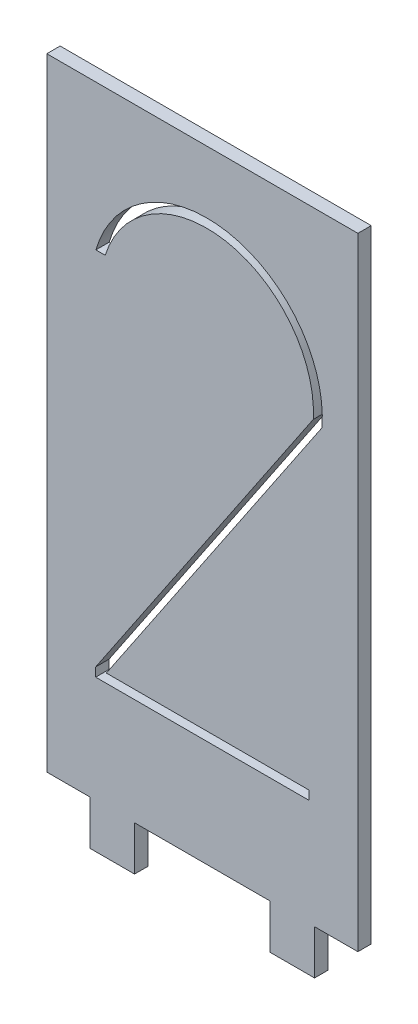
ISO-10303-21;
HEADER;
FILE_DESCRIPTION(('STEP AP214'),'2;1');
FILE_NAME('part.step','',(''),(''),'','','');
FILE_SCHEMA(('AUTOMOTIVE_DESIGN { 1 0 10303 214 1 1 1 1 }'));
ENDSEC;
DATA;
#1=APPLICATION_CONTEXT('core data for automotive mechanical design processes');
#2=APPLICATION_PROTOCOL_DEFINITION('international standard','automotive_design',2000,#1);
#3=PRODUCT_CONTEXT('',#1,'mechanical');
#4=PRODUCT('Part','Part','',(#3));
#5=PRODUCT_RELATED_PRODUCT_CATEGORY('part','',(#4));
#6=PRODUCT_DEFINITION_FORMATION('','',#4);
#7=PRODUCT_DEFINITION_CONTEXT('part definition',#1,'design');
#8=PRODUCT_DEFINITION('design','',#6,#7);
#9=PRODUCT_DEFINITION_SHAPE('','',#8);
#10=(LENGTH_UNIT() NAMED_UNIT(*) SI_UNIT(.MILLI.,.METRE.));
#11=(NAMED_UNIT(*) PLANE_ANGLE_UNIT() SI_UNIT($,.RADIAN.));
#12=(NAMED_UNIT(*) SI_UNIT($,.STERADIAN.) SOLID_ANGLE_UNIT());
#13=UNCERTAINTY_MEASURE_WITH_UNIT(LENGTH_MEASURE(1.E-05),#10,'distance_accuracy_value','');
#14=(GEOMETRIC_REPRESENTATION_CONTEXT(3) GLOBAL_UNCERTAINTY_ASSIGNED_CONTEXT((#13)) GLOBAL_UNIT_ASSIGNED_CONTEXT((#10,
#11,#12)) REPRESENTATION_CONTEXT('',''));
#15=CARTESIAN_POINT('',(0.,0.,0.));
#16=DIRECTION('',(0.,0.,1.));
#17=DIRECTION('',(1.,0.,0.));
#18=AXIS2_PLACEMENT_3D('',#15,#16,#17);
#19=CARTESIAN_POINT('',(0.,0.,1.5));
#20=DIRECTION('',(0.,1.,0.));
#21=DIRECTION('',(0.,0.,1.));
#22=AXIS2_PLACEMENT_3D('',#19,#20,#21);
#23=PLANE('',#22);
#24=DIRECTION('',(1.,0.,0.));
#25=VECTOR('',#24,1.);
#26=CARTESIAN_POINT('',(0.,0.,1.5));
#27=LINE('',#26,#25);
#28=CARTESIAN_POINT('',(4.875,0.,1.5));
#29=VERTEX_POINT('',#28);
#30=CARTESIAN_POINT('',(9.875,0.,1.5));
#31=VERTEX_POINT('',#30);
#32=EDGE_CURVE('E353',#29,#31,#27,.T.);
#33=ORIENTED_EDGE('',*,*,#32,.F.);
#34=DIRECTION('',(0.,0.,1.));
#35=VECTOR('',#34,1.);
#36=CARTESIAN_POINT('',(4.875,0.,-18.5));
#37=LINE('',#36,#35);
#38=CARTESIAN_POINT('',(4.875,0.,0.));
#39=VERTEX_POINT('',#38);
#40=EDGE_CURVE('E290',#39,#29,#37,.T.);
#41=ORIENTED_EDGE('',*,*,#40,.F.);
#42=DIRECTION('',(1.,0.,0.));
#43=VECTOR('',#42,1.);
#44=CARTESIAN_POINT('',(0.,0.,0.));
#45=LINE('',#44,#43);
#46=CARTESIAN_POINT('',(9.875,0.,0.));
#47=VERTEX_POINT('',#46);
#48=EDGE_CURVE('E368',#39,#47,#45,.T.);
#49=ORIENTED_EDGE('',*,*,#48,.T.);
#50=DIRECTION('',(0.,0.,1.));
#51=VECTOR('',#50,1.);
#52=CARTESIAN_POINT('',(9.875,0.,-18.5));
#53=LINE('',#52,#51);
#54=EDGE_CURVE('E330',#47,#31,#53,.T.);
#55=ORIENTED_EDGE('',*,*,#54,.T.);
#56=EDGE_LOOP('',(#33,#41,#49,#55));
#57=FACE_BOUND('',#56,.T.);
#58=ADVANCED_FACE('F39',(#57),#23,.F.);
#59=CARTESIAN_POINT('',(0.,0.,1.5));
#60=DIRECTION('',(1.,0.,0.));
#61=DIRECTION('',(0.,1.,0.));
#62=AXIS2_PLACEMENT_3D('',#59,#60,#61);
#63=PLANE('',#62);
#64=DIRECTION('',(0.,-1.,0.));
#65=VECTOR('',#64,1.);
#66=CARTESIAN_POINT('',(0.,0.,0.));
#67=LINE('',#66,#65);
#68=CARTESIAN_POINT('',(0.,75.,0.));
#69=VERTEX_POINT('',#68);
#70=CARTESIAN_POINT('',(0.,5.,0.));
#71=VERTEX_POINT('',#70);
#72=EDGE_CURVE('E334',#69,#71,#67,.T.);
#73=ORIENTED_EDGE('',*,*,#72,.T.);
#74=DIRECTION('',(0.,0.,1.));
#75=VECTOR('',#74,1.);
#76=CARTESIAN_POINT('',(0.,5.,-18.5));
#77=LINE('',#76,#75);
#78=CARTESIAN_POINT('',(0.,5.,1.5));
#79=VERTEX_POINT('',#78);
#80=EDGE_CURVE('E314',#71,#79,#77,.T.);
#81=ORIENTED_EDGE('',*,*,#80,.T.);
#82=DIRECTION('',(0.,-1.,0.));
#83=VECTOR('',#82,1.);
#84=CARTESIAN_POINT('',(0.,0.,1.5));
#85=LINE('',#84,#83);
#86=CARTESIAN_POINT('',(0.,75.,1.5));
#87=VERTEX_POINT('',#86);
#88=EDGE_CURVE('E344',#87,#79,#85,.T.);
#89=ORIENTED_EDGE('',*,*,#88,.F.);
#90=DIRECTION('',(0.,0.,-1.));
#91=VECTOR('',#90,1.);
#92=CARTESIAN_POINT('',(0.,75.,1.5));
#93=LINE('',#92,#91);
#94=EDGE_CURVE('E360',#87,#69,#93,.T.);
#95=ORIENTED_EDGE('',*,*,#94,.T.);
#96=EDGE_LOOP('',(#73,#81,#89,#95));
#97=FACE_BOUND('',#96,.T.);
#98=ADVANCED_FACE('F41',(#97),#63,.F.);
#99=CARTESIAN_POINT('',(25.125,0.,0.));
#100=VERTEX_POINT('',#99);
#101=CARTESIAN_POINT('',(30.125,0.,0.));
#102=VERTEX_POINT('',#101);
#103=EDGE_CURVE('E364',#100,#102,#45,.T.);
#104=ORIENTED_EDGE('',*,*,#103,.T.);
#105=DIRECTION('',(0.,0.,1.));
#106=VECTOR('',#105,1.);
#107=CARTESIAN_POINT('',(30.125,0.,-18.5));
#108=LINE('',#107,#106);
#109=CARTESIAN_POINT('',(30.125,0.,1.5));
#110=VERTEX_POINT('',#109);
#111=EDGE_CURVE('E294',#102,#110,#108,.T.);
#112=ORIENTED_EDGE('',*,*,#111,.T.);
#113=CARTESIAN_POINT('',(25.125,0.,1.5));
#114=VERTEX_POINT('',#113);
#115=EDGE_CURVE('E348',#114,#110,#27,.T.);
#116=ORIENTED_EDGE('',*,*,#115,.F.);
#117=DIRECTION('',(0.,0.,1.));
#118=VECTOR('',#117,1.);
#119=CARTESIAN_POINT('',(25.125,0.,-18.5));
#120=LINE('',#119,#118);
#121=EDGE_CURVE('E338',#100,#114,#120,.T.);
#122=ORIENTED_EDGE('',*,*,#121,.F.);
#123=EDGE_LOOP('',(#104,#112,#116,#122));
#124=FACE_BOUND('',#123,.T.);
#125=ADVANCED_FACE('F433',(#124),#23,.F.);
#126=CARTESIAN_POINT('',(35.,0.,1.5));
#127=DIRECTION('',(-1.,0.,0.));
#128=DIRECTION('',(0.,-1.,0.));
#129=AXIS2_PLACEMENT_3D('',#126,#127,#128);
#130=PLANE('',#129);
#131=DIRECTION('',(0.,1.,0.));
#132=VECTOR('',#131,1.);
#133=CARTESIAN_POINT('',(35.,0.,1.5));
#134=LINE('',#133,#132);
#135=CARTESIAN_POINT('',(35.,5.,1.5));
#136=VERTEX_POINT('',#135);
#137=CARTESIAN_POINT('',(35.,75.,1.5));
#138=VERTEX_POINT('',#137);
#139=EDGE_CURVE('E354',#136,#138,#134,.T.);
#140=ORIENTED_EDGE('',*,*,#139,.F.);
#141=DIRECTION('',(0.,0.,1.));
#142=VECTOR('',#141,1.);
#143=CARTESIAN_POINT('',(35.,5.,-18.5));
#144=LINE('',#143,#142);
#145=CARTESIAN_POINT('',(35.,5.,0.));
#146=VERTEX_POINT('',#145);
#147=EDGE_CURVE('E299',#146,#136,#144,.T.);
#148=ORIENTED_EDGE('',*,*,#147,.F.);
#149=DIRECTION('',(0.,1.,0.));
#150=VECTOR('',#149,1.);
#151=CARTESIAN_POINT('',(35.,0.,0.));
#152=LINE('',#151,#150);
#153=CARTESIAN_POINT('',(35.,75.,0.));
#154=VERTEX_POINT('',#153);
#155=EDGE_CURVE('E369',#146,#154,#152,.T.);
#156=ORIENTED_EDGE('',*,*,#155,.T.);
#157=DIRECTION('',(0.,0.,-1.));
#158=VECTOR('',#157,1.);
#159=CARTESIAN_POINT('',(35.,75.,1.5));
#160=LINE('',#159,#158);
#161=EDGE_CURVE('E377',#138,#154,#160,.T.);
#162=ORIENTED_EDGE('',*,*,#161,.F.);
#163=EDGE_LOOP('',(#140,#148,#156,#162));
#164=FACE_BOUND('',#163,.T.);
#165=ADVANCED_FACE('F448',(#164),#130,.F.);
#166=CARTESIAN_POINT('',(0.,75.,1.5));
#167=DIRECTION('',(0.,-1.,0.));
#168=DIRECTION('',(0.,0.,-1.));
#169=AXIS2_PLACEMENT_3D('',#166,#167,#168);
#170=PLANE('',#169);
#171=DIRECTION('',(-1.,0.,0.));
#172=VECTOR('',#171,1.);
#173=CARTESIAN_POINT('',(0.,75.,0.));
#174=LINE('',#173,#172);
#175=EDGE_CURVE('E349',#154,#69,#174,.T.);
#176=ORIENTED_EDGE('',*,*,#175,.T.);
#177=ORIENTED_EDGE('',*,*,#94,.F.);
#178=DIRECTION('',(-1.,0.,0.));
#179=VECTOR('',#178,1.);
#180=CARTESIAN_POINT('',(0.,75.,1.5));
#181=LINE('',#180,#179);
#182=EDGE_CURVE('E357',#138,#87,#181,.T.);
#183=ORIENTED_EDGE('',*,*,#182,.F.);
#184=ORIENTED_EDGE('',*,*,#161,.T.);
#185=EDGE_LOOP('',(#176,#177,#183,#184));
#186=FACE_BOUND('',#185,.T.);
#187=ADVANCED_FACE('F454',(#186),#170,.F.);
#188=CARTESIAN_POINT('',(0.,0.,1.5));
#189=DIRECTION('',(0.,0.,-1.));
#190=DIRECTION('',(-1.,0.,0.));
#191=AXIS2_PLACEMENT_3D('',#188,#189,#190);
#192=PLANE('',#191);
#193=DIRECTION('',(1.,0.,0.));
#194=VECTOR('',#193,1.);
#195=CARTESIAN_POINT('',(6.5662215065745,58.642623966769,1.5));
#196=LINE('',#195,#194);
#197=CARTESIAN_POINT('',(5.52076562297513,58.642623966769,1.5));
#198=VERTEX_POINT('',#197);
#199=CARTESIAN_POINT('',(6.5662215065745,58.642623966769,1.5));
#200=VERTEX_POINT('',#199);
#201=EDGE_CURVE('E236',#198,#200,#196,.T.);
#202=ORIENTED_EDGE('',*,*,#201,.F.);
#203=CARTESIAN_POINT('',(18.,55.,1.5));
#204=DIRECTION('',(0.,0.,1.));
#205=DIRECTION('',(-1.,0.,0.));
#206=AXIS2_PLACEMENT_3D('',#203,#204,#205);
#207=CIRCLE('',#206,13.);
#208=CARTESIAN_POINT('',(30.9639247837912,54.0321910311413,1.5));
#209=VERTEX_POINT('',#208);
#210=EDGE_CURVE('E55',#209,#198,#207,.T.);
#211=ORIENTED_EDGE('',*,*,#210,.F.);
#212=DIRECTION('',(0.558558365457829,0.82946522071578,0.));
#213=VECTOR('',#212,1.);
#214=CARTESIAN_POINT('',(6.69999999999999,18.,1.5));
#215=LINE('',#214,#213);
#216=CARTESIAN_POINT('',(6.69999999999999,18.,1.5));
#217=VERTEX_POINT('',#216);
#218=EDGE_CURVE('E204',#217,#209,#215,.T.);
#219=ORIENTED_EDGE('',*,*,#218,.F.);
#220=DIRECTION('',(-1.,0.,0.));
#221=VECTOR('',#220,1.);
#222=CARTESIAN_POINT('',(29.5,18.,1.5));
#223=LINE('',#222,#221);
#224=CARTESIAN_POINT('',(29.5,18.,1.5));
#225=VERTEX_POINT('',#224);
#226=EDGE_CURVE('E208',#225,#217,#223,.T.);
#227=ORIENTED_EDGE('',*,*,#226,.F.);
#228=DIRECTION('',(0.,1.,0.));
#229=VECTOR('',#228,1.);
#230=CARTESIAN_POINT('',(29.5,17.,1.5));
#231=LINE('',#230,#229);
#232=CARTESIAN_POINT('',(29.5,17.,1.5));
#233=VERTEX_POINT('',#232);
#234=EDGE_CURVE('E255',#233,#225,#231,.T.);
#235=ORIENTED_EDGE('',*,*,#234,.F.);
#236=DIRECTION('',(1.,0.,0.));
#237=VECTOR('',#236,1.);
#238=CARTESIAN_POINT('',(5.49999999999999,17.,1.5));
#239=LINE('',#238,#237);
#240=CARTESIAN_POINT('',(5.49999999999999,17.,1.5));
#241=VERTEX_POINT('',#240);
#242=EDGE_CURVE('E251',#241,#233,#239,.T.);
#243=ORIENTED_EDGE('',*,*,#242,.F.);
#244=DIRECTION('',(0.,-1.,0.));
#245=VECTOR('',#244,1.);
#246=CARTESIAN_POINT('',(5.49999999999999,18.,1.5));
#247=LINE('',#246,#245);
#248=CARTESIAN_POINT('',(5.49999999999999,18.,1.5));
#249=VERTEX_POINT('',#248);
#250=EDGE_CURVE('E247',#249,#241,#247,.T.);
#251=ORIENTED_EDGE('',*,*,#250,.F.);
#252=DIRECTION('',(-0.558558365457829,-0.82946522071578,0.));
#253=VECTOR('',#252,1.);
#254=CARTESIAN_POINT('',(29.9827701680452,54.357178796393,1.5));
#255=LINE('',#254,#253);
#256=CARTESIAN_POINT('',(29.9827701680452,54.357178796393,1.5));
#257=VERTEX_POINT('',#256);
#258=EDGE_CURVE('E243',#257,#249,#255,.T.);
#259=ORIENTED_EDGE('',*,*,#258,.F.);
#260=CARTESIAN_POINT('',(18.,55.,1.5));
#261=DIRECTION('',(0.,0.,-1.));
#262=DIRECTION('',(-1.,0.,0.));
#263=AXIS2_PLACEMENT_3D('',#260,#261,#262);
#264=CIRCLE('',#263,12.);
#265=EDGE_CURVE('E239',#200,#257,#264,.T.);
#266=ORIENTED_EDGE('',*,*,#265,.F.);
#267=EDGE_LOOP('',(#202,#211,#219,#227,#235,#243,#251,#259,#266));
#268=FACE_BOUND('',#267,.T.);
#269=DIRECTION('',(-1.,0.,0.));
#270=VECTOR('',#269,1.);
#271=CARTESIAN_POINT('',(4.875,5.,1.5));
#272=LINE('',#271,#270);
#273=CARTESIAN_POINT('',(4.875,5.,1.5));
#274=VERTEX_POINT('',#273);
#275=EDGE_CURVE('E308',#274,#79,#272,.T.);
#276=ORIENTED_EDGE('',*,*,#275,.F.);
#277=DIRECTION('',(0.,1.,0.));
#278=VECTOR('',#277,1.);
#279=CARTESIAN_POINT('',(4.875,5.,1.5));
#280=LINE('',#279,#278);
#281=EDGE_CURVE('E265',#29,#274,#280,.T.);
#282=ORIENTED_EDGE('',*,*,#281,.F.);
#283=ORIENTED_EDGE('',*,*,#32,.T.);
#284=DIRECTION('',(0.,-1.,0.));
#285=VECTOR('',#284,1.);
#286=CARTESIAN_POINT('',(9.875,0.,1.5));
#287=LINE('',#286,#285);
#288=CARTESIAN_POINT('',(9.875,5.,1.5));
#289=VERTEX_POINT('',#288);
#290=EDGE_CURVE('E298',#289,#31,#287,.T.);
#291=ORIENTED_EDGE('',*,*,#290,.F.);
#292=DIRECTION('',(-1.,0.,0.));
#293=VECTOR('',#292,1.);
#294=CARTESIAN_POINT('',(9.875,5.,1.5));
#295=LINE('',#294,#293);
#296=CARTESIAN_POINT('',(25.125,5.,1.5));
#297=VERTEX_POINT('',#296);
#298=EDGE_CURVE('E326',#297,#289,#295,.T.);
#299=ORIENTED_EDGE('',*,*,#298,.F.);
#300=DIRECTION('',(0.,1.,0.));
#301=VECTOR('',#300,1.);
#302=CARTESIAN_POINT('',(25.125,0.,1.5));
#303=LINE('',#302,#301);
#304=EDGE_CURVE('E322',#114,#297,#303,.T.);
#305=ORIENTED_EDGE('',*,*,#304,.F.);
#306=ORIENTED_EDGE('',*,*,#115,.T.);
#307=DIRECTION('',(0.,-1.,0.));
#308=VECTOR('',#307,1.);
#309=CARTESIAN_POINT('',(30.125,5.,1.5));
#310=LINE('',#309,#308);
#311=CARTESIAN_POINT('',(30.125,5.,1.5));
#312=VERTEX_POINT('',#311);
#313=EDGE_CURVE('E286',#312,#110,#310,.T.);
#314=ORIENTED_EDGE('',*,*,#313,.F.);
#315=DIRECTION('',(-1.,0.,0.));
#316=VECTOR('',#315,1.);
#317=CARTESIAN_POINT('',(30.125,5.,1.5));
#318=LINE('',#317,#316);
#319=EDGE_CURVE('E289',#136,#312,#318,.T.);
#320=ORIENTED_EDGE('',*,*,#319,.F.);
#321=ORIENTED_EDGE('',*,*,#139,.T.);
#322=ORIENTED_EDGE('',*,*,#182,.T.);
#323=ORIENTED_EDGE('',*,*,#88,.T.);
#324=EDGE_LOOP('',(#276,#282,#283,#291,#299,#305,#306,#314,#320,#321,#322,#323));
#325=FACE_BOUND('',#324,.T.);
#326=ADVANCED_FACE('F420',(#268,#325),#192,.F.);
#327=CARTESIAN_POINT('',(0.,0.,0.));
#328=DIRECTION('',(0.,0.,-1.));
#329=DIRECTION('',(-1.,0.,0.));
#330=AXIS2_PLACEMENT_3D('',#327,#328,#329);
#331=PLANE('',#330);
#332=CARTESIAN_POINT('',(18.,55.,0.));
#333=DIRECTION('',(0.,0.,1.));
#334=DIRECTION('',(-1.,0.,0.));
#335=AXIS2_PLACEMENT_3D('',#332,#333,#334);
#336=CIRCLE('',#335,13.);
#337=CARTESIAN_POINT('',(30.9639247837912,54.0321910311413,0.));
#338=VERTEX_POINT('',#337);
#339=CARTESIAN_POINT('',(5.52076562297513,58.642623966769,0.));
#340=VERTEX_POINT('',#339);
#341=EDGE_CURVE('E184',#338,#340,#336,.T.);
#342=ORIENTED_EDGE('',*,*,#341,.T.);
#343=DIRECTION('',(1.,0.,0.));
#344=VECTOR('',#343,1.);
#345=CARTESIAN_POINT('',(6.5662215065745,58.642623966769,0.));
#346=LINE('',#345,#344);
#347=CARTESIAN_POINT('',(6.5662215065745,58.642623966769,0.));
#348=VERTEX_POINT('',#347);
#349=EDGE_CURVE('E194',#340,#348,#346,.T.);
#350=ORIENTED_EDGE('',*,*,#349,.T.);
#351=CARTESIAN_POINT('',(18.,55.,0.));
#352=DIRECTION('',(0.,0.,-1.));
#353=DIRECTION('',(-1.,0.,0.));
#354=AXIS2_PLACEMENT_3D('',#351,#352,#353);
#355=CIRCLE('',#354,12.);
#356=CARTESIAN_POINT('',(29.9827701680452,54.357178796393,0.));
#357=VERTEX_POINT('',#356);
#358=EDGE_CURVE('E63',#348,#357,#355,.T.);
#359=ORIENTED_EDGE('',*,*,#358,.T.);
#360=DIRECTION('',(-0.558558365457829,-0.82946522071578,0.));
#361=VECTOR('',#360,1.);
#362=CARTESIAN_POINT('',(29.9827701680452,54.357178796393,0.));
#363=LINE('',#362,#361);
#364=CARTESIAN_POINT('',(5.49999999999999,18.,0.));
#365=VERTEX_POINT('',#364);
#366=EDGE_CURVE('E213',#357,#365,#363,.T.);
#367=ORIENTED_EDGE('',*,*,#366,.T.);
#368=DIRECTION('',(0.,-1.,0.));
#369=VECTOR('',#368,1.);
#370=CARTESIAN_POINT('',(5.49999999999999,18.,0.));
#371=LINE('',#370,#369);
#372=CARTESIAN_POINT('',(5.49999999999999,17.,0.));
#373=VERTEX_POINT('',#372);
#374=EDGE_CURVE('E217',#365,#373,#371,.T.);
#375=ORIENTED_EDGE('',*,*,#374,.T.);
#376=DIRECTION('',(1.,0.,0.));
#377=VECTOR('',#376,1.);
#378=CARTESIAN_POINT('',(5.49999999999999,17.,0.));
#379=LINE('',#378,#377);
#380=CARTESIAN_POINT('',(29.5,17.,0.));
#381=VERTEX_POINT('',#380);
#382=EDGE_CURVE('E221',#373,#381,#379,.T.);
#383=ORIENTED_EDGE('',*,*,#382,.T.);
#384=DIRECTION('',(0.,1.,0.));
#385=VECTOR('',#384,1.);
#386=CARTESIAN_POINT('',(29.5,17.,0.));
#387=LINE('',#386,#385);
#388=CARTESIAN_POINT('',(29.5,18.,0.));
#389=VERTEX_POINT('',#388);
#390=EDGE_CURVE('E225',#381,#389,#387,.T.);
#391=ORIENTED_EDGE('',*,*,#390,.T.);
#392=DIRECTION('',(-1.,0.,0.));
#393=VECTOR('',#392,1.);
#394=CARTESIAN_POINT('',(29.5,18.,0.));
#395=LINE('',#394,#393);
#396=CARTESIAN_POINT('',(6.69999999999999,18.,0.));
#397=VERTEX_POINT('',#396);
#398=EDGE_CURVE('E229',#389,#397,#395,.T.);
#399=ORIENTED_EDGE('',*,*,#398,.T.);
#400=DIRECTION('',(0.558558365457829,0.82946522071578,0.));
#401=VECTOR('',#400,1.);
#402=CARTESIAN_POINT('',(6.69999999999999,18.,0.));
#403=LINE('',#402,#401);
#404=EDGE_CURVE('E191',#397,#338,#403,.T.);
#405=ORIENTED_EDGE('',*,*,#404,.T.);
#406=EDGE_LOOP('',(#342,#350,#359,#367,#375,#383,#391,#399,#405));
#407=FACE_BOUND('',#406,.T.);
#408=DIRECTION('',(0.,-1.,0.));
#409=VECTOR('',#408,1.);
#410=CARTESIAN_POINT('',(4.875,0.,0.));
#411=LINE('',#410,#409);
#412=CARTESIAN_POINT('',(4.875,5.,0.));
#413=VERTEX_POINT('',#412);
#414=EDGE_CURVE('E11',#413,#39,#411,.T.);
#415=ORIENTED_EDGE('',*,*,#414,.F.);
#416=DIRECTION('',(1.,0.,0.));
#417=VECTOR('',#416,1.);
#418=CARTESIAN_POINT('',(0.,5.,0.));
#419=LINE('',#418,#417);
#420=EDGE_CURVE('E48',#71,#413,#419,.T.);
#421=ORIENTED_EDGE('',*,*,#420,.F.);
#422=ORIENTED_EDGE('',*,*,#72,.F.);
#423=ORIENTED_EDGE('',*,*,#175,.F.);
#424=ORIENTED_EDGE('',*,*,#155,.F.);
#425=DIRECTION('',(1.,0.,0.));
#426=VECTOR('',#425,1.);
#427=CARTESIAN_POINT('',(0.,5.,0.));
#428=LINE('',#427,#426);
#429=CARTESIAN_POINT('',(30.125,5.,0.));
#430=VERTEX_POINT('',#429);
#431=EDGE_CURVE('E391',#430,#146,#428,.T.);
#432=ORIENTED_EDGE('',*,*,#431,.F.);
#433=DIRECTION('',(0.,1.,0.));
#434=VECTOR('',#433,1.);
#435=CARTESIAN_POINT('',(30.125,0.,0.));
#436=LINE('',#435,#434);
#437=EDGE_CURVE('E394',#102,#430,#436,.T.);
#438=ORIENTED_EDGE('',*,*,#437,.F.);
#439=ORIENTED_EDGE('',*,*,#103,.F.);
#440=DIRECTION('',(0.,-1.,0.));
#441=VECTOR('',#440,1.);
#442=CARTESIAN_POINT('',(25.125,0.,0.));
#443=LINE('',#442,#441);
#444=CARTESIAN_POINT('',(25.125,5.,0.));
#445=VERTEX_POINT('',#444);
#446=EDGE_CURVE('E381',#445,#100,#443,.T.);
#447=ORIENTED_EDGE('',*,*,#446,.F.);
#448=DIRECTION('',(1.,0.,0.));
#449=VECTOR('',#448,1.);
#450=CARTESIAN_POINT('',(0.,5.,0.));
#451=LINE('',#450,#449);
#452=CARTESIAN_POINT('',(9.875,5.,0.));
#453=VERTEX_POINT('',#452);
#454=EDGE_CURVE('E384',#453,#445,#451,.T.);
#455=ORIENTED_EDGE('',*,*,#454,.F.);
#456=DIRECTION('',(0.,1.,0.));
#457=VECTOR('',#456,1.);
#458=CARTESIAN_POINT('',(9.875,0.,0.));
#459=LINE('',#458,#457);
#460=EDGE_CURVE('E388',#47,#453,#459,.T.);
#461=ORIENTED_EDGE('',*,*,#460,.F.);
#462=ORIENTED_EDGE('',*,*,#48,.F.);
#463=EDGE_LOOP('',(#415,#421,#422,#423,#424,#432,#438,#439,#447,#455,#461,#462));
#464=FACE_BOUND('',#463,.T.);
#465=ADVANCED_FACE('F199',(#407,#464),#331,.T.);
#466=CARTESIAN_POINT('',(9.875,0.,-18.5));
#467=DIRECTION('',(-1.,0.,0.));
#468=DIRECTION('',(0.,-1.,0.));
#469=AXIS2_PLACEMENT_3D('',#466,#467,#468);
#470=PLANE('',#469);
#471=ORIENTED_EDGE('',*,*,#460,.T.);
#472=DIRECTION('',(0.,0.,1.));
#473=VECTOR('',#472,1.);
#474=CARTESIAN_POINT('',(9.875,5.,-18.5));
#475=LINE('',#474,#473);
#476=EDGE_CURVE('E331',#453,#289,#475,.T.);
#477=ORIENTED_EDGE('',*,*,#476,.T.);
#478=ORIENTED_EDGE('',*,*,#290,.T.);
#479=ORIENTED_EDGE('',*,*,#54,.F.);
#480=EDGE_LOOP('',(#471,#477,#478,#479));
#481=FACE_BOUND('',#480,.T.);
#482=ADVANCED_FACE('F423',(#481),#470,.F.);
#483=CARTESIAN_POINT('',(9.875,5.,-18.5));
#484=DIRECTION('',(0.,1.,0.));
#485=DIRECTION('',(0.,0.,1.));
#486=AXIS2_PLACEMENT_3D('',#483,#484,#485);
#487=PLANE('',#486);
#488=ORIENTED_EDGE('',*,*,#454,.T.);
#489=DIRECTION('',(0.,0.,1.));
#490=VECTOR('',#489,1.);
#491=CARTESIAN_POINT('',(25.125,5.,-18.5));
#492=LINE('',#491,#490);
#493=EDGE_CURVE('E335',#445,#297,#492,.T.);
#494=ORIENTED_EDGE('',*,*,#493,.T.);
#495=ORIENTED_EDGE('',*,*,#298,.T.);
#496=ORIENTED_EDGE('',*,*,#476,.F.);
#497=EDGE_LOOP('',(#488,#494,#495,#496));
#498=FACE_BOUND('',#497,.T.);
#499=ADVANCED_FACE('F426',(#498),#487,.F.);
#500=CARTESIAN_POINT('',(25.125,0.,-18.5));
#501=DIRECTION('',(1.,0.,0.));
#502=DIRECTION('',(0.,0.,-1.));
#503=AXIS2_PLACEMENT_3D('',#500,#501,#502);
#504=PLANE('',#503);
#505=ORIENTED_EDGE('',*,*,#446,.T.);
#506=ORIENTED_EDGE('',*,*,#121,.T.);
#507=ORIENTED_EDGE('',*,*,#304,.T.);
#508=ORIENTED_EDGE('',*,*,#493,.F.);
#509=EDGE_LOOP('',(#505,#506,#507,#508));
#510=FACE_BOUND('',#509,.T.);
#511=ADVANCED_FACE('F475',(#510),#504,.F.);
#512=CARTESIAN_POINT('',(30.125,5.,-18.5));
#513=DIRECTION('',(-1.,0.,0.));
#514=DIRECTION('',(0.,0.,1.));
#515=AXIS2_PLACEMENT_3D('',#512,#513,#514);
#516=PLANE('',#515);
#517=ORIENTED_EDGE('',*,*,#437,.T.);
#518=DIRECTION('',(0.,0.,1.));
#519=VECTOR('',#518,1.);
#520=CARTESIAN_POINT('',(30.125,5.,-18.5));
#521=LINE('',#520,#519);
#522=EDGE_CURVE('E295',#430,#312,#521,.T.);
#523=ORIENTED_EDGE('',*,*,#522,.T.);
#524=ORIENTED_EDGE('',*,*,#313,.T.);
#525=ORIENTED_EDGE('',*,*,#111,.F.);
#526=EDGE_LOOP('',(#517,#523,#524,#525));
#527=FACE_BOUND('',#526,.T.);
#528=ADVANCED_FACE('F437',(#527),#516,.F.);
#529=CARTESIAN_POINT('',(30.125,5.,-18.5));
#530=DIRECTION('',(0.,1.,0.));
#531=DIRECTION('',(0.,0.,1.));
#532=AXIS2_PLACEMENT_3D('',#529,#530,#531);
#533=PLANE('',#532);
#534=ORIENTED_EDGE('',*,*,#431,.T.);
#535=ORIENTED_EDGE('',*,*,#147,.T.);
#536=ORIENTED_EDGE('',*,*,#319,.T.);
#537=ORIENTED_EDGE('',*,*,#522,.F.);
#538=EDGE_LOOP('',(#534,#535,#536,#537));
#539=FACE_BOUND('',#538,.T.);
#540=ADVANCED_FACE('F444',(#539),#533,.F.);
#541=CARTESIAN_POINT('',(4.875,5.,-18.5));
#542=DIRECTION('',(1.,0.,0.));
#543=DIRECTION('',(0.,1.,0.));
#544=AXIS2_PLACEMENT_3D('',#541,#542,#543);
#545=PLANE('',#544);
#546=ORIENTED_EDGE('',*,*,#414,.T.);
#547=ORIENTED_EDGE('',*,*,#40,.T.);
#548=ORIENTED_EDGE('',*,*,#281,.T.);
#549=DIRECTION('',(0.,0.,1.));
#550=VECTOR('',#549,1.);
#551=CARTESIAN_POINT('',(4.875,5.,-18.5));
#552=LINE('',#551,#550);
#553=EDGE_CURVE('E311',#413,#274,#552,.T.);
#554=ORIENTED_EDGE('',*,*,#553,.F.);
#555=EDGE_LOOP('',(#546,#547,#548,#554));
#556=FACE_BOUND('',#555,.T.);
#557=ADVANCED_FACE('F405',(#556),#545,.F.);
#558=CARTESIAN_POINT('',(4.875,5.,-18.5));
#559=DIRECTION('',(0.,1.,0.));
#560=DIRECTION('',(-1.,0.,0.));
#561=AXIS2_PLACEMENT_3D('',#558,#559,#560);
#562=PLANE('',#561);
#563=ORIENTED_EDGE('',*,*,#420,.T.);
#564=ORIENTED_EDGE('',*,*,#553,.T.);
#565=ORIENTED_EDGE('',*,*,#275,.T.);
#566=ORIENTED_EDGE('',*,*,#80,.F.);
#567=EDGE_LOOP('',(#563,#564,#565,#566));
#568=FACE_BOUND('',#567,.T.);
#569=ADVANCED_FACE('F401',(#568),#562,.F.);
#570=CARTESIAN_POINT('',(18.,55.,0.));
#571=DIRECTION('',(0.,0.,1.));
#572=DIRECTION('',(1.,0.,0.));
#573=AXIS2_PLACEMENT_3D('',#570,#571,#572);
#574=CYLINDRICAL_SURFACE('',#573,13.);
#575=ORIENTED_EDGE('',*,*,#210,.T.);
#576=DIRECTION('',(0.,0.,1.));
#577=VECTOR('',#576,1.);
#578=CARTESIAN_POINT('',(5.52076562297513,58.642623966769,0.));
#579=LINE('',#578,#577);
#580=EDGE_CURVE('E180',#340,#198,#579,.T.);
#581=ORIENTED_EDGE('',*,*,#580,.F.);
#582=ORIENTED_EDGE('',*,*,#341,.F.);
#583=DIRECTION('',(0.,0.,1.));
#584=VECTOR('',#583,1.);
#585=CARTESIAN_POINT('',(30.9639247837912,54.0321910311413,0.));
#586=LINE('',#585,#584);
#587=EDGE_CURVE('E262',#338,#209,#586,.T.);
#588=ORIENTED_EDGE('',*,*,#587,.T.);
#589=EDGE_LOOP('',(#575,#581,#582,#588));
#590=FACE_BOUND('',#589,.T.);
#591=ADVANCED_FACE('F182',(#590),#574,.F.);
#592=CARTESIAN_POINT('',(6.69999999999999,18.,0.));
#593=DIRECTION('',(0.82946522071578,-0.558558365457829,0.));
#594=DIRECTION('',(0.558558365457829,0.82946522071578,0.));
#595=AXIS2_PLACEMENT_3D('',#592,#593,#594);
#596=PLANE('',#595);
#597=ORIENTED_EDGE('',*,*,#218,.T.);
#598=ORIENTED_EDGE('',*,*,#587,.F.);
#599=ORIENTED_EDGE('',*,*,#404,.F.);
#600=DIRECTION('',(0.,0.,1.));
#601=VECTOR('',#600,1.);
#602=CARTESIAN_POINT('',(6.69999999999999,18.,0.));
#603=LINE('',#602,#601);
#604=EDGE_CURVE('E266',#397,#217,#603,.T.);
#605=ORIENTED_EDGE('',*,*,#604,.T.);
#606=EDGE_LOOP('',(#597,#598,#599,#605));
#607=FACE_BOUND('',#606,.T.);
#608=ADVANCED_FACE('F490',(#607),#596,.F.);
#609=CARTESIAN_POINT('',(29.5,18.,0.));
#610=DIRECTION('',(0.,1.,0.));
#611=DIRECTION('',(-1.,0.,0.));
#612=AXIS2_PLACEMENT_3D('',#609,#610,#611);
#613=PLANE('',#612);
#614=ORIENTED_EDGE('',*,*,#226,.T.);
#615=ORIENTED_EDGE('',*,*,#604,.F.);
#616=ORIENTED_EDGE('',*,*,#398,.F.);
#617=DIRECTION('',(0.,0.,1.));
#618=VECTOR('',#617,1.);
#619=CARTESIAN_POINT('',(29.5,18.,0.));
#620=LINE('',#619,#618);
#621=EDGE_CURVE('E269',#389,#225,#620,.T.);
#622=ORIENTED_EDGE('',*,*,#621,.T.);
#623=EDGE_LOOP('',(#614,#615,#616,#622));
#624=FACE_BOUND('',#623,.T.);
#625=ADVANCED_FACE('F511',(#624),#613,.F.);
#626=CARTESIAN_POINT('',(29.5,17.,0.));
#627=DIRECTION('',(1.,0.,0.));
#628=DIRECTION('',(0.,0.,-1.));
#629=AXIS2_PLACEMENT_3D('',#626,#627,#628);
#630=PLANE('',#629);
#631=ORIENTED_EDGE('',*,*,#234,.T.);
#632=ORIENTED_EDGE('',*,*,#621,.F.);
#633=ORIENTED_EDGE('',*,*,#390,.F.);
#634=DIRECTION('',(0.,0.,1.));
#635=VECTOR('',#634,1.);
#636=CARTESIAN_POINT('',(29.5,17.,0.));
#637=LINE('',#636,#635);
#638=EDGE_CURVE('E272',#381,#233,#637,.T.);
#639=ORIENTED_EDGE('',*,*,#638,.T.);
#640=EDGE_LOOP('',(#631,#632,#633,#639));
#641=FACE_BOUND('',#640,.T.);
#642=ADVANCED_FACE('F507',(#641),#630,.F.);
#643=CARTESIAN_POINT('',(5.49999999999999,17.,0.));
#644=DIRECTION('',(0.,-1.,0.));
#645=DIRECTION('',(0.,0.,-1.));
#646=AXIS2_PLACEMENT_3D('',#643,#644,#645);
#647=PLANE('',#646);
#648=ORIENTED_EDGE('',*,*,#242,.T.);
#649=ORIENTED_EDGE('',*,*,#638,.F.);
#650=ORIENTED_EDGE('',*,*,#382,.F.);
#651=DIRECTION('',(0.,0.,1.));
#652=VECTOR('',#651,1.);
#653=CARTESIAN_POINT('',(5.49999999999999,17.,0.));
#654=LINE('',#653,#652);
#655=EDGE_CURVE('E275',#373,#241,#654,.T.);
#656=ORIENTED_EDGE('',*,*,#655,.T.);
#657=EDGE_LOOP('',(#648,#649,#650,#656));
#658=FACE_BOUND('',#657,.T.);
#659=ADVANCED_FACE('F503',(#658),#647,.F.);
#660=CARTESIAN_POINT('',(5.49999999999999,18.,0.));
#661=DIRECTION('',(-1.,0.,0.));
#662=DIRECTION('',(0.,0.,1.));
#663=AXIS2_PLACEMENT_3D('',#660,#661,#662);
#664=PLANE('',#663);
#665=ORIENTED_EDGE('',*,*,#250,.T.);
#666=ORIENTED_EDGE('',*,*,#655,.F.);
#667=ORIENTED_EDGE('',*,*,#374,.F.);
#668=DIRECTION('',(0.,0.,1.));
#669=VECTOR('',#668,1.);
#670=CARTESIAN_POINT('',(5.49999999999999,18.,0.));
#671=LINE('',#670,#669);
#672=EDGE_CURVE('E278',#365,#249,#671,.T.);
#673=ORIENTED_EDGE('',*,*,#672,.T.);
#674=EDGE_LOOP('',(#665,#666,#667,#673));
#675=FACE_BOUND('',#674,.T.);
#676=ADVANCED_FACE('F499',(#675),#664,.F.);
#677=CARTESIAN_POINT('',(29.9827701680452,54.357178796393,0.));
#678=DIRECTION('',(-0.82946522071578,0.558558365457829,0.));
#679=DIRECTION('',(-0.558558365457829,-0.82946522071578,0.));
#680=AXIS2_PLACEMENT_3D('',#677,#678,#679);
#681=PLANE('',#680);
#682=ORIENTED_EDGE('',*,*,#258,.T.);
#683=ORIENTED_EDGE('',*,*,#672,.F.);
#684=ORIENTED_EDGE('',*,*,#366,.F.);
#685=DIRECTION('',(0.,0.,1.));
#686=VECTOR('',#685,1.);
#687=CARTESIAN_POINT('',(29.9827701680452,54.357178796393,0.));
#688=LINE('',#687,#686);
#689=EDGE_CURVE('E281',#357,#257,#688,.T.);
#690=ORIENTED_EDGE('',*,*,#689,.T.);
#691=EDGE_LOOP('',(#682,#683,#684,#690));
#692=FACE_BOUND('',#691,.T.);
#693=ADVANCED_FACE('F496',(#692),#681,.F.);
#694=CARTESIAN_POINT('',(18.,55.,0.));
#695=DIRECTION('',(0.,0.,1.));
#696=DIRECTION('',(1.,0.,0.));
#697=AXIS2_PLACEMENT_3D('',#694,#695,#696);
#698=CYLINDRICAL_SURFACE('',#697,12.);
#699=ORIENTED_EDGE('',*,*,#265,.T.);
#700=ORIENTED_EDGE('',*,*,#689,.F.);
#701=ORIENTED_EDGE('',*,*,#358,.F.);
#702=DIRECTION('',(0.,0.,1.));
#703=VECTOR('',#702,1.);
#704=CARTESIAN_POINT('',(6.5662215065745,58.642623966769,0.));
#705=LINE('',#704,#703);
#706=EDGE_CURVE('E190',#348,#200,#705,.T.);
#707=ORIENTED_EDGE('',*,*,#706,.T.);
#708=EDGE_LOOP('',(#699,#700,#701,#707));
#709=FACE_BOUND('',#708,.T.);
#710=ADVANCED_FACE('F493',(#709),#698,.T.);
#711=CARTESIAN_POINT('',(6.5662215065745,58.642623966769,0.));
#712=DIRECTION('',(0.,-1.,0.));
#713=DIRECTION('',(1.,0.,0.));
#714=AXIS2_PLACEMENT_3D('',#711,#712,#713);
#715=PLANE('',#714);
#716=ORIENTED_EDGE('',*,*,#201,.T.);
#717=ORIENTED_EDGE('',*,*,#706,.F.);
#718=ORIENTED_EDGE('',*,*,#349,.F.);
#719=ORIENTED_EDGE('',*,*,#580,.T.);
#720=EDGE_LOOP('',(#716,#717,#718,#719));
#721=FACE_BOUND('',#720,.T.);
#722=ADVANCED_FACE('F195',(#721),#715,.F.);
#723=CLOSED_SHELL('',(#58,#98,#125,#165,#187,#326,#465,#482,#499,#511,#528,#540,#557,#569,#591,
#608,#625,#642,#659,#676,#693,#710,#722));
#724=MANIFOLD_SOLID_BREP('B2',#723);
#725=ADVANCED_BREP_SHAPE_REPRESENTATION('',(#18,#724),#14);
#726=SHAPE_DEFINITION_REPRESENTATION(#9,#725);
ENDSEC;
END-ISO-10303-21;
